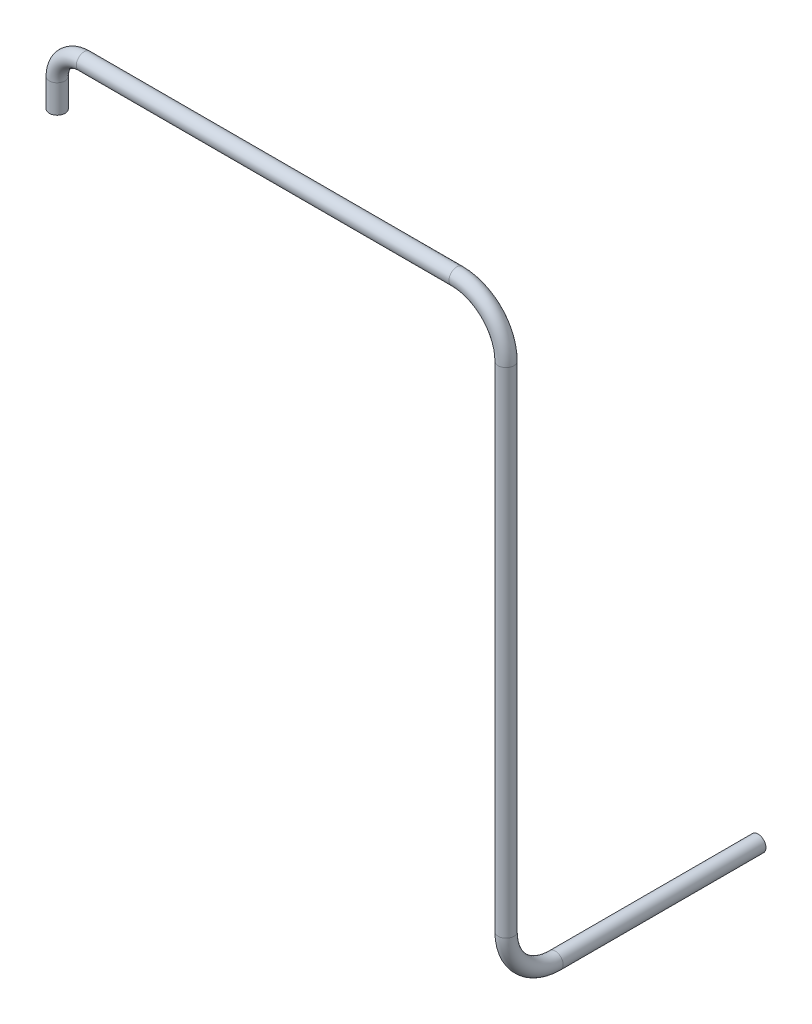
ISO-10303-21;
HEADER;
FILE_DESCRIPTION(('STEP AP214'),'2;1');
FILE_NAME('part.step','',(''),(''),'','','');
FILE_SCHEMA(('AUTOMOTIVE_DESIGN { 1 0 10303 214 1 1 1 1 }'));
ENDSEC;
DATA;
#1=APPLICATION_CONTEXT('core data for automotive mechanical design processes');
#2=APPLICATION_PROTOCOL_DEFINITION('international standard','automotive_design',2000,#1);
#3=PRODUCT_CONTEXT('',#1,'mechanical');
#4=PRODUCT('Part','Part','',(#3));
#5=PRODUCT_RELATED_PRODUCT_CATEGORY('part','',(#4));
#6=PRODUCT_DEFINITION_FORMATION('','',#4);
#7=PRODUCT_DEFINITION_CONTEXT('part definition',#1,'design');
#8=PRODUCT_DEFINITION('design','',#6,#7);
#9=PRODUCT_DEFINITION_SHAPE('','',#8);
#10=(LENGTH_UNIT() NAMED_UNIT(*) SI_UNIT(.MILLI.,.METRE.));
#11=(NAMED_UNIT(*) PLANE_ANGLE_UNIT() SI_UNIT($,.RADIAN.));
#12=(NAMED_UNIT(*) SI_UNIT($,.STERADIAN.) SOLID_ANGLE_UNIT());
#13=UNCERTAINTY_MEASURE_WITH_UNIT(LENGTH_MEASURE(1.E-05),#10,'distance_accuracy_value','');
#14=(GEOMETRIC_REPRESENTATION_CONTEXT(3) GLOBAL_UNCERTAINTY_ASSIGNED_CONTEXT((#13)) GLOBAL_UNIT_ASSIGNED_CONTEXT((#10,
#11,#12)) REPRESENTATION_CONTEXT('',''));
#15=CARTESIAN_POINT('',(0.,0.,0.));
#16=DIRECTION('',(0.,0.,1.));
#17=DIRECTION('',(1.,0.,0.));
#18=AXIS2_PLACEMENT_3D('',#15,#16,#17);
#19=CARTESIAN_POINT('',(228.,-273.,-128.));
#20=DIRECTION('',(0.,0.,1.));
#21=DIRECTION('',(1.,0.,0.));
#22=AXIS2_PLACEMENT_3D('',#19,#20,#21);
#23=PLANE('',#22);
#24=CARTESIAN_POINT('',(228.,-273.,-128.));
#25=DIRECTION('',(0.,0.,1.));
#26=DIRECTION('',(1.,0.,0.));
#27=AXIS2_PLACEMENT_3D('',#24,#25,#26);
#28=CIRCLE('',#27,3.);
#29=CARTESIAN_POINT('',(231.,-273.,-128.));
#30=VERTEX_POINT('',#29);
#31=EDGE_CURVE('E287',#30,#30,#28,.T.);
#32=ORIENTED_EDGE('',*,*,#31,.T.);
#33=EDGE_LOOP('',(#32));
#34=FACE_BOUND('',#33,.T.);
#35=CARTESIAN_POINT('',(228.,-273.,-128.));
#36=DIRECTION('',(0.,0.,1.));
#37=DIRECTION('',(1.,0.,0.));
#38=AXIS2_PLACEMENT_3D('',#35,#36,#37);
#39=CIRCLE('',#38,4.);
#40=CARTESIAN_POINT('',(232.,-273.,-128.));
#41=VERTEX_POINT('',#40);
#42=EDGE_CURVE('E70',#41,#41,#39,.T.);
#43=ORIENTED_EDGE('',*,*,#42,.F.);
#44=EDGE_LOOP('',(#43));
#45=FACE_BOUND('',#44,.T.);
#46=ADVANCED_FACE('F67',(#34,#45),#23,.F.);
#47=CARTESIAN_POINT('',(0.,0.,0.));
#48=DIRECTION('',(0.,-1.,0.));
#49=DIRECTION('',(-1.,0.,0.));
#50=AXIS2_PLACEMENT_3D('',#47,#48,#49);
#51=PLANE('',#50);
#52=CARTESIAN_POINT('',(0.,0.,0.));
#53=DIRECTION('',(0.,-1.,0.));
#54=DIRECTION('',(0.,0.,-1.));
#55=AXIS2_PLACEMENT_3D('',#52,#53,#54);
#56=CIRCLE('',#55,3.);
#57=CARTESIAN_POINT('',(0.,0.,-3.00000000000006));
#58=VERTEX_POINT('',#57);
#59=EDGE_CURVE('E317',#58,#58,#56,.T.);
#60=ORIENTED_EDGE('',*,*,#59,.F.);
#61=EDGE_LOOP('',(#60));
#62=FACE_BOUND('',#61,.T.);
#63=CARTESIAN_POINT('',(0.,0.,0.));
#64=DIRECTION('',(0.,-1.,0.));
#65=DIRECTION('',(-1.,0.,0.));
#66=AXIS2_PLACEMENT_3D('',#63,#64,#65);
#67=CIRCLE('',#66,4.);
#68=CARTESIAN_POINT('',(-4.00000000000003,0.,0.));
#69=VERTEX_POINT('',#68);
#70=EDGE_CURVE('E84',#69,#69,#67,.T.);
#71=ORIENTED_EDGE('',*,*,#70,.T.);
#72=EDGE_LOOP('',(#71));
#73=FACE_BOUND('',#72,.T.);
#74=ADVANCED_FACE('F109',(#62,#73),#51,.T.);
#75=CARTESIAN_POINT('',(228.,-273.,-25.));
#76=DIRECTION('',(0.,0.,-1.));
#77=DIRECTION('',(-1.,0.,0.));
#78=AXIS2_PLACEMENT_3D('',#75,#76,#77);
#79=CYLINDRICAL_SURFACE('',#78,4.);
#80=ORIENTED_EDGE('',*,*,#42,.T.);
#81=EDGE_LOOP('',(#80));
#82=FACE_BOUND('',#81,.T.);
#83=CARTESIAN_POINT('',(228.,-273.,-25.));
#84=DIRECTION('',(0.,-6.42331404357729E-08,0.999999999999998));
#85=DIRECTION('',(1.,0.,0.));
#86=AXIS2_PLACEMENT_3D('',#83,#84,#85);
#87=CIRCLE('',#86,4.);
#88=CARTESIAN_POINT('',(228.,-277.,-25.0000002569326));
#89=VERTEX_POINT('',#88);
#90=EDGE_CURVE('E95',#89,#89,#87,.T.);
#91=ORIENTED_EDGE('',*,*,#90,.F.);
#92=EDGE_LOOP('',(#91));
#93=FACE_BOUND('',#92,.T.);
#94=ADVANCED_FACE('F110',(#82,#93),#79,.T.);
#95=CARTESIAN_POINT('',(228.,3.,0.));
#96=DIRECTION('',(0.,-1.,0.));
#97=DIRECTION('',(1.,0.,0.));
#98=AXIS2_PLACEMENT_3D('',#95,#96,#97);
#99=CYLINDRICAL_SURFACE('',#98,4.);
#100=CARTESIAN_POINT('',(228.,-248.000001605828,0.));
#101=DIRECTION('',(0.,1.,0.));
#102=DIRECTION('',(1.,0.,0.));
#103=AXIS2_PLACEMENT_3D('',#100,#101,#102);
#104=CIRCLE('',#103,4.);
#105=CARTESIAN_POINT('',(228.,-248.000001605828,3.99999999999995));
#106=VERTEX_POINT('',#105);
#107=EDGE_CURVE('E96',#106,#106,#104,.T.);
#108=ORIENTED_EDGE('',*,*,#107,.T.);
#109=EDGE_LOOP('',(#108));
#110=FACE_BOUND('',#109,.T.);
#111=CARTESIAN_POINT('',(228.,3.00000000000003,0.));
#112=DIRECTION('',(6.42331426735666E-08,0.999999999999998,0.));
#113=DIRECTION('',(0.999999999999998,-6.42331426735666E-08,0.));
#114=AXIS2_PLACEMENT_3D('',#111,#112,#113);
#115=CIRCLE('',#114,4.);
#116=CARTESIAN_POINT('',(232.,2.99999974306746,0.));
#117=VERTEX_POINT('',#116);
#118=EDGE_CURVE('E93',#117,#117,#115,.T.);
#119=ORIENTED_EDGE('',*,*,#118,.F.);
#120=EDGE_LOOP('',(#119));
#121=FACE_BOUND('',#120,.T.);
#122=ADVANCED_FACE('F108',(#110,#121),#99,.T.);
#123=CARTESIAN_POINT('',(228.,-248.000001605828,-24.9999983941716));
#124=DIRECTION('',(1.,0.,0.));
#125=DIRECTION('',(0.,0.,-1.));
#126=AXIS2_PLACEMENT_3D('',#123,#124,#125);
#127=TOROIDAL_SURFACE('',#126,24.9999983941715,4.);
#128=CARTESIAN_POINT('',(228.,-248.000001605828,-24.9999983941716));
#129=DIRECTION('',(1.,0.,0.));
#130=DIRECTION('',(0.,0.,-1.));
#131=AXIS2_PLACEMENT_3D('',#128,#129,#130);
#132=CIRCLE('',#131,28.9999983941715);
#133=EDGE_CURVE('',#106,#89,#132,.T.);
#134=ORIENTED_EDGE('',*,*,#107,.F.);
#135=ORIENTED_EDGE('',*,*,#90,.T.);
#136=ORIENTED_EDGE('',*,*,#133,.T.);
#137=ORIENTED_EDGE('',*,*,#133,.F.);
#138=EDGE_LOOP('',(#134,#136,#135,#137));
#139=FACE_BOUND('',#138,.T.);
#140=ADVANCED_FACE('F102',(#139),#127,.T.);
#141=CARTESIAN_POINT('',(13.72,28.,0.));
#142=DIRECTION('',(1.,0.,0.));
#143=DIRECTION('',(0.,0.,-1.));
#144=AXIS2_PLACEMENT_3D('',#141,#142,#143);
#145=CYLINDRICAL_SURFACE('',#144,4.);
#146=CARTESIAN_POINT('',(203.000001605829,28.,0.));
#147=DIRECTION('',(-1.,0.,0.));
#148=DIRECTION('',(0.,1.,0.));
#149=AXIS2_PLACEMENT_3D('',#146,#147,#148);
#150=CIRCLE('',#149,4.);
#151=CARTESIAN_POINT('',(203.000001605829,32.0000000000001,0.));
#152=VERTEX_POINT('',#151);
#153=EDGE_CURVE('E87',#152,#152,#150,.T.);
#154=ORIENTED_EDGE('',*,*,#153,.T.);
#155=EDGE_LOOP('',(#154));
#156=FACE_BOUND('',#155,.T.);
#157=CARTESIAN_POINT('',(13.72,28.,0.));
#158=DIRECTION('',(-1.,-9.42627385298324E-09,0.));
#159=DIRECTION('',(-9.42627385298325E-09,1.,0.));
#160=AXIS2_PLACEMENT_3D('',#157,#158,#159);
#161=CIRCLE('',#160,4.);
#162=CARTESIAN_POINT('',(13.7199999622949,32.,0.));
#163=VERTEX_POINT('',#162);
#164=EDGE_CURVE('E11',#163,#163,#161,.T.);
#165=ORIENTED_EDGE('',*,*,#164,.F.);
#166=EDGE_LOOP('',(#165));
#167=FACE_BOUND('',#166,.T.);
#168=ADVANCED_FACE('F139',(#156,#167),#145,.T.);
#169=CARTESIAN_POINT('',(203.000001605829,3.00000160582849,0.));
#170=DIRECTION('',(0.,0.,-1.));
#171=DIRECTION('',(-1.,0.,0.));
#172=AXIS2_PLACEMENT_3D('',#169,#170,#171);
#173=TOROIDAL_SURFACE('',#172,24.9999983941716,4.);
#174=CARTESIAN_POINT('',(203.000001605829,3.00000160582849,0.));
#175=DIRECTION('',(0.,0.,-1.));
#176=DIRECTION('',(-1.,0.,0.));
#177=AXIS2_PLACEMENT_3D('',#174,#175,#176);
#178=CIRCLE('',#177,28.9999983941716);
#179=EDGE_CURVE('',#152,#117,#178,.T.);
#180=ORIENTED_EDGE('',*,*,#153,.F.);
#181=ORIENTED_EDGE('',*,*,#118,.T.);
#182=ORIENTED_EDGE('',*,*,#179,.T.);
#183=ORIENTED_EDGE('',*,*,#179,.F.);
#184=EDGE_LOOP('',(#180,#182,#181,#183));
#185=FACE_BOUND('',#184,.T.);
#186=ADVANCED_FACE('F134',(#185),#173,.T.);
#187=CARTESIAN_POINT('',(0.,0.,0.));
#188=DIRECTION('',(0.,1.,0.));
#189=DIRECTION('',(0.,0.,1.));
#190=AXIS2_PLACEMENT_3D('',#187,#188,#189);
#191=CYLINDRICAL_SURFACE('',#190,4.);
#192=CARTESIAN_POINT('',(0.,14.2799998706715,0.));
#193=DIRECTION('',(0.,-1.,0.));
#194=DIRECTION('',(-1.,0.,0.));
#195=AXIS2_PLACEMENT_3D('',#192,#193,#194);
#196=CIRCLE('',#195,4.);
#197=CARTESIAN_POINT('',(-4.00000000000003,14.2799998706715,0.));
#198=VERTEX_POINT('',#197);
#199=EDGE_CURVE('E73',#198,#198,#196,.T.);
#200=ORIENTED_EDGE('',*,*,#199,.T.);
#201=EDGE_LOOP('',(#200));
#202=FACE_BOUND('',#201,.T.);
#203=ORIENTED_EDGE('',*,*,#70,.F.);
#204=EDGE_LOOP('',(#203));
#205=FACE_BOUND('',#204,.T.);
#206=ADVANCED_FACE('F123',(#202,#205),#191,.T.);
#207=CARTESIAN_POINT('',(13.7200001293285,14.2799998706715,0.));
#208=DIRECTION('',(0.,0.,-1.));
#209=DIRECTION('',(-1.,0.,0.));
#210=AXIS2_PLACEMENT_3D('',#207,#208,#209);
#211=TOROIDAL_SURFACE('',#210,13.7200001293285,4.);
#212=CARTESIAN_POINT('',(13.7200001293285,14.2799998706715,0.));
#213=DIRECTION('',(0.,0.,-1.));
#214=DIRECTION('',(-1.,0.,0.));
#215=AXIS2_PLACEMENT_3D('',#212,#213,#214);
#216=CIRCLE('',#215,17.7200001293285);
#217=EDGE_CURVE('',#198,#163,#216,.T.);
#218=ORIENTED_EDGE('',*,*,#199,.F.);
#219=ORIENTED_EDGE('',*,*,#164,.T.);
#220=ORIENTED_EDGE('',*,*,#217,.T.);
#221=ORIENTED_EDGE('',*,*,#217,.F.);
#222=EDGE_LOOP('',(#218,#220,#219,#221));
#223=FACE_BOUND('',#222,.T.);
#224=ADVANCED_FACE('F121',(#223),#211,.T.);
#225=CARTESIAN_POINT('',(0.,-1.,0.));
#226=DIRECTION('',(0.,1.,0.));
#227=DIRECTION('',(0.,0.,1.));
#228=AXIS2_PLACEMENT_3D('',#225,#226,#227);
#229=CYLINDRICAL_SURFACE('',#228,3.);
#230=CARTESIAN_POINT('',(0.,14.2799998706715,0.));
#231=DIRECTION('',(0.,-1.,0.));
#232=DIRECTION('',(-1.,0.,0.));
#233=AXIS2_PLACEMENT_3D('',#230,#231,#232);
#234=CIRCLE('',#233,3.);
#235=CARTESIAN_POINT('',(-3.00000000000003,14.2799998706715,0.));
#236=VERTEX_POINT('',#235);
#237=EDGE_CURVE('E283',#236,#236,#234,.T.);
#238=ORIENTED_EDGE('',*,*,#237,.F.);
#239=EDGE_LOOP('',(#238));
#240=FACE_BOUND('',#239,.T.);
#241=ORIENTED_EDGE('',*,*,#59,.T.);
#242=EDGE_LOOP('',(#241));
#243=FACE_BOUND('',#242,.T.);
#244=ADVANCED_FACE('F124',(#240,#243),#229,.F.);
#245=CARTESIAN_POINT('',(228.,-273.,-25.));
#246=DIRECTION('',(0.,0.,-1.));
#247=DIRECTION('',(-1.,0.,0.));
#248=AXIS2_PLACEMENT_3D('',#245,#246,#247);
#249=CYLINDRICAL_SURFACE('',#248,3.);
#250=ORIENTED_EDGE('',*,*,#31,.F.);
#251=EDGE_LOOP('',(#250));
#252=FACE_BOUND('',#251,.T.);
#253=CARTESIAN_POINT('',(228.,-273.,-25.));
#254=DIRECTION('',(0.,-6.42331404357729E-08,0.999999999999998));
#255=DIRECTION('',(1.,0.,0.));
#256=AXIS2_PLACEMENT_3D('',#253,#254,#255);
#257=CIRCLE('',#256,3.);
#258=CARTESIAN_POINT('',(228.,-276.,-25.0000001926994));
#259=VERTEX_POINT('',#258);
#260=EDGE_CURVE('E302',#259,#259,#257,.T.);
#261=ORIENTED_EDGE('',*,*,#260,.T.);
#262=EDGE_LOOP('',(#261));
#263=FACE_BOUND('',#262,.T.);
#264=ADVANCED_FACE('F129',(#252,#263),#249,.F.);
#265=CARTESIAN_POINT('',(228.,3.,0.));
#266=DIRECTION('',(0.,-1.,0.));
#267=DIRECTION('',(1.,0.,0.));
#268=AXIS2_PLACEMENT_3D('',#265,#266,#267);
#269=CYLINDRICAL_SURFACE('',#268,3.);
#270=CARTESIAN_POINT('',(228.,-248.000001605828,0.));
#271=DIRECTION('',(0.,1.,0.));
#272=DIRECTION('',(1.,0.,0.));
#273=AXIS2_PLACEMENT_3D('',#270,#271,#272);
#274=CIRCLE('',#273,3.);
#275=CARTESIAN_POINT('',(228.,-248.000001605828,2.99999999999995));
#276=VERTEX_POINT('',#275);
#277=EDGE_CURVE('E291',#276,#276,#274,.T.);
#278=ORIENTED_EDGE('',*,*,#277,.F.);
#279=EDGE_LOOP('',(#278));
#280=FACE_BOUND('',#279,.T.);
#281=CARTESIAN_POINT('',(228.,3.00000000000003,0.));
#282=DIRECTION('',(6.42331426735666E-08,0.999999999999998,0.));
#283=DIRECTION('',(0.999999999999998,-6.42331426735666E-08,0.));
#284=AXIS2_PLACEMENT_3D('',#281,#282,#283);
#285=CIRCLE('',#284,3.);
#286=CARTESIAN_POINT('',(231.,2.9999998073006,0.));
#287=VERTEX_POINT('',#286);
#288=EDGE_CURVE('E313',#287,#287,#285,.T.);
#289=ORIENTED_EDGE('',*,*,#288,.T.);
#290=EDGE_LOOP('',(#289));
#291=FACE_BOUND('',#290,.T.);
#292=ADVANCED_FACE('F192',(#280,#291),#269,.F.);
#293=CARTESIAN_POINT('',(228.,-248.000001605828,-24.9999983941716));
#294=DIRECTION('',(1.,0.,0.));
#295=DIRECTION('',(0.,0.,-1.));
#296=AXIS2_PLACEMENT_3D('',#293,#294,#295);
#297=TOROIDAL_SURFACE('',#296,24.9999983941715,3.);
#298=CARTESIAN_POINT('',(228.,-248.000001605828,-24.9999983941716));
#299=DIRECTION('',(1.,0.,0.));
#300=DIRECTION('',(0.,0.,-1.));
#301=AXIS2_PLACEMENT_3D('',#298,#299,#300);
#302=CIRCLE('',#301,27.9999983941715);
#303=EDGE_CURVE('',#276,#259,#302,.T.);
#304=ORIENTED_EDGE('',*,*,#277,.T.);
#305=ORIENTED_EDGE('',*,*,#260,.F.);
#306=ORIENTED_EDGE('',*,*,#303,.T.);
#307=ORIENTED_EDGE('',*,*,#303,.F.);
#308=EDGE_LOOP('',(#304,#306,#305,#307));
#309=FACE_BOUND('',#308,.T.);
#310=ADVANCED_FACE('F205',(#309),#297,.F.);
#311=CARTESIAN_POINT('',(13.72,28.,0.));
#312=DIRECTION('',(1.,0.,0.));
#313=DIRECTION('',(0.,0.,-1.));
#314=AXIS2_PLACEMENT_3D('',#311,#312,#313);
#315=CYLINDRICAL_SURFACE('',#314,3.);
#316=CARTESIAN_POINT('',(203.000001605829,28.,0.));
#317=DIRECTION('',(-1.,0.,0.));
#318=DIRECTION('',(0.,1.,0.));
#319=AXIS2_PLACEMENT_3D('',#316,#317,#318);
#320=CIRCLE('',#319,3.);
#321=CARTESIAN_POINT('',(203.000001605829,31.0000000000001,0.));
#322=VERTEX_POINT('',#321);
#323=EDGE_CURVE('E306',#322,#322,#320,.T.);
#324=ORIENTED_EDGE('',*,*,#323,.F.);
#325=EDGE_LOOP('',(#324));
#326=FACE_BOUND('',#325,.T.);
#327=CARTESIAN_POINT('',(13.72,28.,0.));
#328=DIRECTION('',(-1.,-9.42627385298324E-09,0.));
#329=DIRECTION('',(-9.42627385298325E-09,1.,0.));
#330=AXIS2_PLACEMENT_3D('',#327,#328,#329);
#331=CIRCLE('',#330,3.);
#332=CARTESIAN_POINT('',(13.7199999717211,31.,0.));
#333=VERTEX_POINT('',#332);
#334=EDGE_CURVE('E285',#333,#333,#331,.T.);
#335=ORIENTED_EDGE('',*,*,#334,.T.);
#336=EDGE_LOOP('',(#335));
#337=FACE_BOUND('',#336,.T.);
#338=ADVANCED_FACE('F215',(#326,#337),#315,.F.);
#339=CARTESIAN_POINT('',(203.000001605829,3.00000160582849,0.));
#340=DIRECTION('',(0.,0.,-1.));
#341=DIRECTION('',(-1.,0.,0.));
#342=AXIS2_PLACEMENT_3D('',#339,#340,#341);
#343=TOROIDAL_SURFACE('',#342,24.9999983941716,3.);
#344=CARTESIAN_POINT('',(203.000001605829,3.00000160582849,0.));
#345=DIRECTION('',(0.,0.,-1.));
#346=DIRECTION('',(-1.,0.,0.));
#347=AXIS2_PLACEMENT_3D('',#344,#345,#346);
#348=CIRCLE('',#347,27.9999983941716);
#349=EDGE_CURVE('',#322,#287,#348,.T.);
#350=ORIENTED_EDGE('',*,*,#323,.T.);
#351=ORIENTED_EDGE('',*,*,#288,.F.);
#352=ORIENTED_EDGE('',*,*,#349,.T.);
#353=ORIENTED_EDGE('',*,*,#349,.F.);
#354=EDGE_LOOP('',(#350,#352,#351,#353));
#355=FACE_BOUND('',#354,.T.);
#356=ADVANCED_FACE('F225',(#355),#343,.F.);
#357=CARTESIAN_POINT('',(13.7200001293285,14.2799998706715,0.));
#358=DIRECTION('',(0.,0.,-1.));
#359=DIRECTION('',(-1.,0.,0.));
#360=AXIS2_PLACEMENT_3D('',#357,#358,#359);
#361=TOROIDAL_SURFACE('',#360,13.7200001293285,3.);
#362=CARTESIAN_POINT('',(13.7200001293285,14.2799998706715,0.));
#363=DIRECTION('',(0.,0.,-1.));
#364=DIRECTION('',(-1.,0.,0.));
#365=AXIS2_PLACEMENT_3D('',#362,#363,#364);
#366=CIRCLE('',#365,16.7200001293285);
#367=EDGE_CURVE('',#236,#333,#366,.T.);
#368=ORIENTED_EDGE('',*,*,#237,.T.);
#369=ORIENTED_EDGE('',*,*,#334,.F.);
#370=ORIENTED_EDGE('',*,*,#367,.T.);
#371=ORIENTED_EDGE('',*,*,#367,.F.);
#372=EDGE_LOOP('',(#368,#370,#369,#371));
#373=FACE_BOUND('',#372,.T.);
#374=ADVANCED_FACE('F135',(#373),#361,.F.);
#375=CLOSED_SHELL('',(#46,#74,#94,#122,#140,#168,#186,#206,#224,#244,#264,#292,#310,#338,#356,#374));
#376=MANIFOLD_SOLID_BREP('B2',#375);
#377=ADVANCED_BREP_SHAPE_REPRESENTATION('',(#18,#376),#14);
#378=SHAPE_DEFINITION_REPRESENTATION(#9,#377);
ENDSEC;
END-ISO-10303-21;
